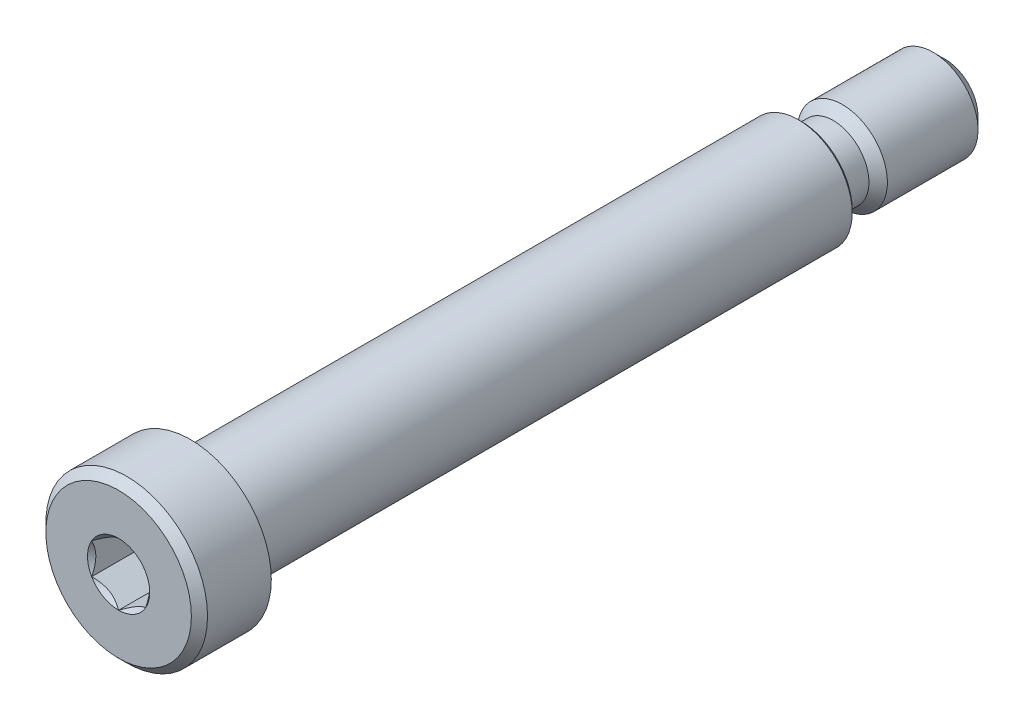
ISO-10303-21;
HEADER;
FILE_DESCRIPTION(('STEP AP214'),'2;1');
FILE_NAME('part.step','',(''),(''),'','','');
FILE_SCHEMA(('AUTOMOTIVE_DESIGN { 1 0 10303 214 1 1 1 1 }'));
ENDSEC;
DATA;
#1=APPLICATION_CONTEXT('core data for automotive mechanical design processes');
#2=APPLICATION_PROTOCOL_DEFINITION('international standard','automotive_design',2000,#1);
#3=PRODUCT_CONTEXT('',#1,'mechanical');
#4=PRODUCT('Part','Part','',(#3));
#5=PRODUCT_RELATED_PRODUCT_CATEGORY('part','',(#4));
#6=PRODUCT_DEFINITION_FORMATION('','',#4);
#7=PRODUCT_DEFINITION_CONTEXT('part definition',#1,'design');
#8=PRODUCT_DEFINITION('design','',#6,#7);
#9=PRODUCT_DEFINITION_SHAPE('','',#8);
#10=(LENGTH_UNIT() NAMED_UNIT(*) SI_UNIT(.MILLI.,.METRE.));
#11=(NAMED_UNIT(*) PLANE_ANGLE_UNIT() SI_UNIT($,.RADIAN.));
#12=(NAMED_UNIT(*) SI_UNIT($,.STERADIAN.) SOLID_ANGLE_UNIT());
#13=UNCERTAINTY_MEASURE_WITH_UNIT(LENGTH_MEASURE(1.E-05),#10,'distance_accuracy_value','');
#14=(GEOMETRIC_REPRESENTATION_CONTEXT(3) GLOBAL_UNCERTAINTY_ASSIGNED_CONTEXT((#13)) GLOBAL_UNIT_ASSIGNED_CONTEXT((#10,
#11,#12)) REPRESENTATION_CONTEXT('',''));
#15=CARTESIAN_POINT('',(0.,0.,0.));
#16=DIRECTION('',(0.,0.,1.));
#17=DIRECTION('',(1.,0.,0.));
#18=AXIS2_PLACEMENT_3D('',#15,#16,#17);
#19=CARTESIAN_POINT('',(0.,6.429375,36.5125));
#20=DIRECTION('',(0.,0.,-1.));
#21=DIRECTION('',(-1.,0.,0.));
#22=AXIS2_PLACEMENT_3D('',#19,#20,#21);
#23=PLANE('',#22);
#24=CARTESIAN_POINT('',(0.,0.,36.5125));
#25=DIRECTION('',(0.,0.,1.));
#26=DIRECTION('',(1.,0.,0.));
#27=AXIS2_PLACEMENT_3D('',#24,#25,#26);
#28=CIRCLE('',#27,2.74963065701559);
#29=CARTESIAN_POINT('',(-2.38125,1.3748153285078,36.5125));
#30=VERTEX_POINT('',#29);
#31=CARTESIAN_POINT('',(-2.38125,-1.37481532850779,36.5125));
#32=VERTEX_POINT('',#31);
#33=EDGE_CURVE('E135',#30,#32,#28,.T.);
#34=ORIENTED_EDGE('',*,*,#33,.F.);
#35=CARTESIAN_POINT('',(0.,2.74963065701559,36.5125));
#36=VERTEX_POINT('',#35);
#37=EDGE_CURVE('E130',#36,#30,#28,.T.);
#38=ORIENTED_EDGE('',*,*,#37,.F.);
#39=CARTESIAN_POINT('',(2.38124999999999,1.3748153285078,36.5125));
#40=VERTEX_POINT('',#39);
#41=EDGE_CURVE('E102',#40,#36,#28,.T.);
#42=ORIENTED_EDGE('',*,*,#41,.F.);
#43=CARTESIAN_POINT('',(2.38124999999999,-1.3748153285078,36.5125));
#44=VERTEX_POINT('',#43);
#45=EDGE_CURVE('E92',#44,#40,#28,.T.);
#46=ORIENTED_EDGE('',*,*,#45,.F.);
#47=CARTESIAN_POINT('',(0.,-2.74963065701559,36.5125));
#48=VERTEX_POINT('',#47);
#49=EDGE_CURVE('E53',#48,#44,#28,.T.);
#50=ORIENTED_EDGE('',*,*,#49,.F.);
#51=EDGE_CURVE('E60',#32,#48,#28,.T.);
#52=ORIENTED_EDGE('',*,*,#51,.F.);
#53=EDGE_LOOP('',(#34,#38,#42,#46,#50,#52));
#54=FACE_BOUND('',#53,.T.);
#55=CARTESIAN_POINT('',(0.,0.,36.5125));
#56=DIRECTION('',(0.,0.,1.));
#57=DIRECTION('',(1.,0.,0.));
#58=AXIS2_PLACEMENT_3D('',#55,#56,#57);
#59=CIRCLE('',#58,6.429375);
#60=CARTESIAN_POINT('',(6.429375,0.,36.5125));
#61=VERTEX_POINT('',#60);
#62=EDGE_CURVE('E47',#61,#61,#59,.T.);
#63=ORIENTED_EDGE('',*,*,#62,.T.);
#64=EDGE_LOOP('',(#63));
#65=FACE_BOUND('',#64,.T.);
#66=ADVANCED_FACE('F39',(#54,#65),#23,.F.);
#67=CARTESIAN_POINT('',(0.,0.,35.798125));
#68=DIRECTION('',(0.,0.,-1.));
#69=DIRECTION('',(-1.,0.,0.));
#70=AXIS2_PLACEMENT_3D('',#67,#68,#69);
#71=CONICAL_SURFACE('',#70,7.14375,0.78539816339745);
#72=ORIENTED_EDGE('',*,*,#62,.F.);
#73=EDGE_LOOP('',(#72));
#74=FACE_BOUND('',#73,.T.);
#75=CARTESIAN_POINT('',(0.,0.,35.798125));
#76=DIRECTION('',(0.,0.,1.));
#77=DIRECTION('',(1.,0.,0.));
#78=AXIS2_PLACEMENT_3D('',#75,#76,#77);
#79=CIRCLE('',#78,7.14375);
#80=CARTESIAN_POINT('',(7.14375,0.,35.798125));
#81=VERTEX_POINT('',#80);
#82=EDGE_CURVE('E283',#81,#81,#79,.T.);
#83=ORIENTED_EDGE('',*,*,#82,.T.);
#84=EDGE_LOOP('',(#83));
#85=FACE_BOUND('',#84,.T.);
#86=ADVANCED_FACE('F207',(#74,#85),#71,.T.);
#87=CARTESIAN_POINT('',(0.,0.,36.5125));
#88=DIRECTION('',(0.,0.,1.));
#89=DIRECTION('',(1.,0.,0.));
#90=AXIS2_PLACEMENT_3D('',#87,#88,#89);
#91=CYLINDRICAL_SURFACE('',#90,7.14375);
#92=ORIENTED_EDGE('',*,*,#82,.F.);
#93=EDGE_LOOP('',(#92));
#94=FACE_BOUND('',#93,.T.);
#95=CARTESIAN_POINT('',(0.,0.,30.1625));
#96=DIRECTION('',(0.,0.,1.));
#97=DIRECTION('',(1.,0.,0.));
#98=AXIS2_PLACEMENT_3D('',#95,#96,#97);
#99=CIRCLE('',#98,7.14375);
#100=CARTESIAN_POINT('',(7.14375,0.,30.1625));
#101=VERTEX_POINT('',#100);
#102=EDGE_CURVE('E280',#101,#101,#99,.T.);
#103=ORIENTED_EDGE('',*,*,#102,.T.);
#104=EDGE_LOOP('',(#103));
#105=FACE_BOUND('',#104,.T.);
#106=ADVANCED_FACE('F211',(#94,#105),#91,.T.);
#107=CARTESIAN_POINT('',(0.,7.14375,30.1625));
#108=DIRECTION('',(0.,0.,1.));
#109=DIRECTION('',(1.,0.,0.));
#110=AXIS2_PLACEMENT_3D('',#107,#108,#109);
#111=PLANE('',#110);
#112=ORIENTED_EDGE('',*,*,#102,.F.);
#113=EDGE_LOOP('',(#112));
#114=FACE_BOUND('',#113,.T.);
#115=CARTESIAN_POINT('',(0.,0.,30.1625));
#116=DIRECTION('',(0.,0.,1.));
#117=DIRECTION('',(1.,0.,0.));
#118=AXIS2_PLACEMENT_3D('',#115,#116,#117);
#119=CIRCLE('',#118,4.7625);
#120=CARTESIAN_POINT('',(4.7625,0.,30.1625));
#121=VERTEX_POINT('',#120);
#122=EDGE_CURVE('E277',#121,#121,#119,.T.);
#123=ORIENTED_EDGE('',*,*,#122,.T.);
#124=EDGE_LOOP('',(#123));
#125=FACE_BOUND('',#124,.T.);
#126=ADVANCED_FACE('F216',(#114,#125),#111,.F.);
#127=CARTESIAN_POINT('',(0.,0.,36.5125));
#128=DIRECTION('',(0.,0.,1.));
#129=DIRECTION('',(1.,0.,0.));
#130=AXIS2_PLACEMENT_3D('',#127,#128,#129);
#131=CYLINDRICAL_SURFACE('',#130,4.7625);
#132=ORIENTED_EDGE('',*,*,#122,.F.);
#133=EDGE_LOOP('',(#132));
#134=FACE_BOUND('',#133,.T.);
#135=CARTESIAN_POINT('',(0.,0.,-23.5500333333333));
#136=DIRECTION('',(0.,0.,1.));
#137=DIRECTION('',(1.,0.,0.));
#138=AXIS2_PLACEMENT_3D('',#135,#136,#137);
#139=CIRCLE('',#138,4.7625);
#140=CARTESIAN_POINT('',(4.7625,0.,-23.5500333333333));
#141=VERTEX_POINT('',#140);
#142=EDGE_CURVE('E274',#141,#141,#139,.T.);
#143=ORIENTED_EDGE('',*,*,#142,.T.);
#144=EDGE_LOOP('',(#143));
#145=FACE_BOUND('',#144,.T.);
#146=ADVANCED_FACE('F224',(#134,#145),#131,.T.);
#147=CARTESIAN_POINT('',(0.,0.,-23.8125));
#148=DIRECTION('',(0.,0.,1.));
#149=DIRECTION('',(1.,0.,0.));
#150=AXIS2_PLACEMENT_3D('',#147,#148,#149);
#151=CONICAL_SURFACE('',#150,4.50003333333333,0.785398163397443);
#152=ORIENTED_EDGE('',*,*,#142,.F.);
#153=EDGE_LOOP('',(#152));
#154=FACE_BOUND('',#153,.T.);
#155=CARTESIAN_POINT('',(0.,0.,-23.8125));
#156=DIRECTION('',(0.,0.,1.));
#157=DIRECTION('',(1.,0.,0.));
#158=AXIS2_PLACEMENT_3D('',#155,#156,#157);
#159=CIRCLE('',#158,4.50003333333333);
#160=CARTESIAN_POINT('',(4.50003333333333,0.,-23.8125));
#161=VERTEX_POINT('',#160);
#162=EDGE_CURVE('E262',#161,#161,#159,.T.);
#163=ORIENTED_EDGE('',*,*,#162,.T.);
#164=EDGE_LOOP('',(#163));
#165=FACE_BOUND('',#164,.T.);
#166=ADVANCED_FACE('F228',(#154,#165),#151,.T.);
#167=CARTESIAN_POINT('',(0.,4.50003333333333,-23.8125));
#168=DIRECTION('',(0.,0.,1.));
#169=DIRECTION('',(1.,0.,0.));
#170=AXIS2_PLACEMENT_3D('',#167,#168,#169);
#171=PLANE('',#170);
#172=CARTESIAN_POINT('',(0.,0.,-23.8125));
#173=DIRECTION('',(0.,0.,-1.));
#174=DIRECTION('',(-1.,0.,0.));
#175=AXIS2_PLACEMENT_3D('',#172,#173,#174);
#176=CIRCLE('',#175,3.9751);
#177=CARTESIAN_POINT('',(-3.9751,0.,-23.8125));
#178=VERTEX_POINT('',#177);
#179=EDGE_CURVE('E537',#178,#178,#176,.T.);
#180=ORIENTED_EDGE('',*,*,#179,.F.);
#181=EDGE_LOOP('',(#180));
#182=FACE_BOUND('',#181,.T.);
#183=ORIENTED_EDGE('',*,*,#162,.F.);
#184=EDGE_LOOP('',(#183));
#185=FACE_BOUND('',#184,.T.);
#186=ADVANCED_FACE('F232',(#182,#185),#171,.F.);
#187=CARTESIAN_POINT('',(0.,0.,36.5125));
#188=DIRECTION('',(0.,0.,1.));
#189=DIRECTION('',(1.,0.,0.));
#190=AXIS2_PLACEMENT_3D('',#187,#188,#189);
#191=CONICAL_SURFACE('',#190,2.74963065701559,0.78539816339745);
#192=ORIENTED_EDGE('',*,*,#41,.T.);
#193=CARTESIAN_POINT('',(2.38145,1.37469985845396,36.5126154773272));
#194=CARTESIAN_POINT('',(2.29959321762095,1.4219598937955,36.4653948967095));
#195=CARTESIAN_POINT('',(2.21636766622824,1.47001018829554,36.4209475752929));
#196=CARTESIAN_POINT('',(2.04666151916196,1.56799007798739,36.3395654569856));
#197=CARTESIAN_POINT('',(1.9601647826469,1.61792899209838,36.3026759430951));
#198=CARTESIAN_POINT('',(1.78574822599096,1.71862843803482,36.2394834131659));
#199=CARTESIAN_POINT('',(1.69787282881932,1.769363322247,36.2130215587295));
#200=CARTESIAN_POINT('',(1.52018740592912,1.87195004898373,36.1722515156161));
#201=CARTESIAN_POINT('',(1.43038280881413,1.92379875730254,36.1579128915306));
#202=CARTESIAN_POINT('',(1.27561039686966,2.01315665100181,36.1449757847701));
#203=CARTESIAN_POINT('',(1.21084255103038,2.05055038423195,36.1430606046532));
#204=CARTESIAN_POINT('',(1.08141272066443,2.1252767316349,36.1462866227677));
#205=CARTESIAN_POINT('',(1.01675078120665,2.16260931978717,36.1514302948571));
#206=CARTESIAN_POINT('',(0.888037451422605,2.23692199538628,36.1684813108716));
#207=CARTESIAN_POINT('',(0.823986825765148,2.27390164135138,36.1803962213493));
#208=CARTESIAN_POINT('',(0.696993161094728,2.34722146783422,36.210335672352));
#209=CARTESIAN_POINT('',(0.634050037564177,2.38356169714822,36.2283597445184));
#210=CARTESIAN_POINT('',(0.472823849267819,2.47664568036154,36.2818688075524));
#211=CARTESIAN_POINT('',(0.375540508712161,2.53281224321902,36.3213874208722));
#212=CARTESIAN_POINT('',(0.232493937374431,2.61540021968751,36.3881003435508));
#213=CARTESIAN_POINT('',(0.185353711056036,2.64261664204209,36.4115402091113));
#214=CARTESIAN_POINT('',(0.0919464736333613,2.69654533571233,36.4605566766595));
#215=CARTESIAN_POINT('',(0.0456789475031773,2.72325790437833,36.4861319667669));
#216=CARTESIAN_POINT('',(-0.000200000000001808,2.74974612706943,36.5126154773272));
#217=B_SPLINE_CURVE_WITH_KNOTS('',3,(#193,#194,#195,#196,#197,#198,#199,#200,#201,#202,#203,
#204,#205,#206,#207,#208,#209,#210,#211,#212,#213,#214,#215,#216),.UNSPECIFIED.,.F.,.F.,(4,2,2,
2,2,2,2,2,2,2,2,4),(0.,0.317196610611948,0.636241461041215,0.950218950629216,1.26340583824125,
1.48752413747843,1.71172100167746,1.93616888974081,2.16059957440835,2.51709639744762,
2.69486147369098,2.87251813383154),.UNSPECIFIED.);
#218=EDGE_CURVE('E11',#40,#36,#217,.T.);
#219=ORIENTED_EDGE('',*,*,#218,.F.);
#220=EDGE_LOOP('',(#192,#219));
#221=FACE_BOUND('',#220,.T.);
#222=ADVANCED_FACE('F105',(#221),#191,.F.);
#223=ORIENTED_EDGE('',*,*,#37,.T.);
#224=CARTESIAN_POINT('',(0.000199999999998976,2.74974612706943,36.5126154773272));
#225=CARTESIAN_POINT('',(-0.0816567823790497,2.70248609172789,36.4653948967095));
#226=CARTESIAN_POINT('',(-0.164882333771759,2.65443579722785,36.4209475752929));
#227=CARTESIAN_POINT('',(-0.334588480838038,2.556455907536,36.3395654569856));
#228=CARTESIAN_POINT('',(-0.421085217353101,2.50651699342501,36.3026759430951));
#229=CARTESIAN_POINT('',(-0.59550177400904,2.40581754748857,36.2394834131659));
#230=CARTESIAN_POINT('',(-0.683377171180672,2.35508266327639,36.2130215587295));
#231=CARTESIAN_POINT('',(-0.861062594070872,2.25249593653966,36.1722515156161));
#232=CARTESIAN_POINT('',(-0.950867191185867,2.20064722822085,36.1579128915305));
#233=CARTESIAN_POINT('',(-1.10563960313034,2.11128933452158,36.1449757847701));
#234=CARTESIAN_POINT('',(-1.17040744896961,2.07389560129144,36.1430606046532));
#235=CARTESIAN_POINT('',(-1.29983727933557,1.99916925388849,36.1462866227677));
#236=CARTESIAN_POINT('',(-1.36449921879335,1.96183666573622,36.1514302948571));
#237=CARTESIAN_POINT('',(-1.49321254857739,1.88752399013711,36.1684813108716));
#238=CARTESIAN_POINT('',(-1.55726317423485,1.85054434417201,36.1803962213493));
#239=CARTESIAN_POINT('',(-1.68425683890527,1.77722451768917,36.210335672352));
#240=CARTESIAN_POINT('',(-1.74719996243582,1.74088428837517,36.2283597445184));
#241=CARTESIAN_POINT('',(-1.90842615073218,1.64780030516185,36.2818688075524));
#242=CARTESIAN_POINT('',(-2.00570949128784,1.59163374230437,36.3213874208722));
#243=CARTESIAN_POINT('',(-2.14875606262557,1.50904576583588,36.3881003435508));
#244=CARTESIAN_POINT('',(-2.19589628894396,1.4818293434813,36.4115402091113));
#245=CARTESIAN_POINT('',(-2.28930352636664,1.42790064981105,36.4605566766595));
#246=CARTESIAN_POINT('',(-2.33557105249682,1.40118808114505,36.4861319667669));
#247=CARTESIAN_POINT('',(-2.38145,1.37469985845396,36.5126154773272));
#248=B_SPLINE_CURVE_WITH_KNOTS('',3,(#224,#225,#226,#227,#228,#229,#230,#231,#232,#233,#234,
#235,#236,#237,#238,#239,#240,#241,#242,#243,#244,#245,#246,#247),.UNSPECIFIED.,.F.,.F.,(4,2,2,
2,2,2,2,2,2,2,2,4),(0.,0.317196610611946,0.636241461041214,0.950218950629218,1.26340583824125,
1.48752413747843,1.71172100167746,1.93616888974081,2.16059957440835,2.51709639744763,
2.69486147369099,2.87251813383154),.UNSPECIFIED.);
#249=EDGE_CURVE('E131',#36,#30,#248,.T.);
#250=ORIENTED_EDGE('',*,*,#249,.F.);
#251=EDGE_LOOP('',(#223,#250));
#252=FACE_BOUND('',#251,.T.);
#253=ADVANCED_FACE('F310',(#252),#191,.F.);
#254=ORIENTED_EDGE('',*,*,#33,.T.);
#255=CARTESIAN_POINT('',(-2.38125,-2.74194290629281,37.3944808948811));
#256=CARTESIAN_POINT('',(-2.38125,-2.67517961094815,37.3440846682677));
#257=CARTESIAN_POINT('',(-2.38125,-2.60804251150404,37.2941755878687));
#258=CARTESIAN_POINT('',(-2.38125,-2.47287325090702,37.1955498312406));
#259=CARTESIAN_POINT('',(-2.38125,-2.40484086929574,37.1468334574882));
#260=CARTESIAN_POINT('',(-2.38125,-2.26723593537395,37.0504648546737));
#261=CARTESIAN_POINT('',(-2.38125,-2.19765553376831,37.0028237956413));
#262=CARTESIAN_POINT('',(-2.38125,-2.05731367870618,36.9093199235723));
#263=CARTESIAN_POINT('',(-2.38125,-1.98655230919794,36.863456984903));
#264=CARTESIAN_POINT('',(-2.38125,-1.83957751933872,36.7713459008639));
#265=CARTESIAN_POINT('',(-2.38125,-1.76328362015338,36.7252255175311));
#266=CARTESIAN_POINT('',(-2.38125,-1.60891357724904,36.6360183040048));
#267=CARTESIAN_POINT('',(-2.38125,-1.53083712168148,36.592932010078));
#268=CARTESIAN_POINT('',(-2.38125,-1.37291620350605,36.5107265015513));
#269=CARTESIAN_POINT('',(-2.38125,-1.29307799952834,36.4715953579213));
#270=CARTESIAN_POINT('',(-2.38125,-1.13121425104689,36.3981679503644));
#271=CARTESIAN_POINT('',(-2.38125,-1.04918943691787,36.3638700954936));
#272=CARTESIAN_POINT('',(-2.38125,-0.889535256852428,36.3038546314485));
#273=CARTESIAN_POINT('',(-2.38125,-0.812083865872988,36.2776684784655));
#274=CARTESIAN_POINT('',(-2.38125,-0.655316366649848,36.2315097515196));
#275=CARTESIAN_POINT('',(-2.38125,-0.5760001303489,36.2115376056152));
#276=CARTESIAN_POINT('',(-2.38125,-0.417295761724886,36.1791821452753));
#277=CARTESIAN_POINT('',(-2.38125,-0.337934577044911,36.1666688083777));
#278=CARTESIAN_POINT('',(-2.38125,-0.178363853149434,36.1494738601797));
#279=CARTESIAN_POINT('',(-2.38125,-0.098154462150851,36.1447909026206));
#280=CARTESIAN_POINT('',(-2.38125,0.059418803226009,36.1436044408343));
#281=CARTESIAN_POINT('',(-2.38125,0.136780588312046,36.1468110104925));
#282=CARTESIAN_POINT('',(-2.38125,0.290840960378522,36.1605870567153));
#283=CARTESIAN_POINT('',(-2.38125,0.367539482199549,36.1711572485512));
#284=CARTESIAN_POINT('',(-2.38125,0.521017492585625,36.1992628297993));
#285=CARTESIAN_POINT('',(-2.38125,0.597774958137447,36.2169167488691));
#286=CARTESIAN_POINT('',(-2.38125,0.74960981398739,36.2582513961625));
#287=CARTESIAN_POINT('',(-2.38125,0.824687344292227,36.2819316201001));
#288=CARTESIAN_POINT('',(-2.38125,1.06107814376439,36.3653948628217));
#289=CARTESIAN_POINT('',(-2.38125,1.21904786183135,36.4346839268647));
#290=CARTESIAN_POINT('',(-2.38125,1.45021000221341,36.5501640836207));
#291=CARTESIAN_POINT('',(-2.38125,1.52644290394185,36.5906730569973));
#292=CARTESIAN_POINT('',(-2.38125,1.67717618485052,36.6748026889314));
#293=CARTESIAN_POINT('',(-2.38125,1.75167687303398,36.7184227867715));
#294=CARTESIAN_POINT('',(-2.38125,1.89548152028666,36.8059125561176));
#295=CARTESIAN_POINT('',(-2.38125,1.96485959547431,36.84966179235));
#296=CARTESIAN_POINT('',(-2.38125,2.10242624345816,36.9390011582982));
#297=CARTESIAN_POINT('',(-2.38125,2.17061472559402,36.9845914274512));
#298=CARTESIAN_POINT('',(-2.38125,2.3054031724641,37.0769060045998));
#299=CARTESIAN_POINT('',(-2.38125,2.37201154149389,37.1236180923826));
#300=CARTESIAN_POINT('',(-2.38125,2.50431799978026,37.2182775774644));
#301=CARTESIAN_POINT('',(-2.38125,2.57001633432537,37.2662246315223));
#302=CARTESIAN_POINT('',(-2.38125,2.63533378775873,37.3146767329484));
#303=B_SPLINE_CURVE_WITH_KNOTS('',3,(#255,#256,#257,#258,#259,#260,#261,#262,#263,#264,#265,
#266,#267,#268,#269,#270,#271,#272,#273,#274,#275,#276,#277,#278,#279,#280,#281,#282,#283,#284,
#285,#286,#287,#288,#289,#290,#291,#292,#293,#294,#295,#296,#297,#298,#299,#300,#301,#302),
.UNSPECIFIED.,.F.,.F.,(4,2,2,2,2,2,2,2,2,2,2,2,2,2,2,2,2,2,2,2,2,2,2,4),(0.,0.250951284057751,
0.501965564923428,0.754924776117816,1.00786608183831,1.2752620782364,1.54270521810291,
1.80931602064962,2.0758388585355,2.32089852628726,2.56597507150036,2.80664400340548,
3.04727155341464,3.27918940999225,3.51112979724109,3.74712477430216,3.98310000960233,
4.49898139186047,4.75794323923242,5.01685853131886,5.26288959989713,5.50893933760937,
5.7529903835543,5.99697431578282),.UNSPECIFIED.);
#304=EDGE_CURVE('E133',#30,#32,#303,.F.);
#305=ORIENTED_EDGE('',*,*,#304,.F.);
#306=EDGE_LOOP('',(#254,#305));
#307=FACE_BOUND('',#306,.T.);
#308=ADVANCED_FACE('F303',(#307),#191,.F.);
#309=ORIENTED_EDGE('',*,*,#51,.T.);
#310=CARTESIAN_POINT('',(-2.38145,-1.37469985845396,36.5126154773272));
#311=CARTESIAN_POINT('',(-2.29959321762095,-1.4219598937955,36.4653948967095));
#312=CARTESIAN_POINT('',(-2.21636766622824,-1.47001018829554,36.4209475752929));
#313=CARTESIAN_POINT('',(-2.04666151916196,-1.56799007798739,36.3395654569856));
#314=CARTESIAN_POINT('',(-1.9601647826469,-1.61792899209839,36.3026759430951));
#315=CARTESIAN_POINT('',(-1.78574822599096,-1.71862843803482,36.2394834131659));
#316=CARTESIAN_POINT('',(-1.69787282881933,-1.76936332224701,36.2130215587295));
#317=CARTESIAN_POINT('',(-1.52018740592912,-1.87195004898374,36.1722515156161));
#318=CARTESIAN_POINT('',(-1.43038280881413,-1.92379875730255,36.1579128915306));
#319=CARTESIAN_POINT('',(-1.27561039686966,-2.01315665100181,36.1449757847701));
#320=CARTESIAN_POINT('',(-1.21084255103038,-2.05055038423195,36.1430606046532));
#321=CARTESIAN_POINT('',(-1.08141272066443,-2.1252767316349,36.1462866227677));
#322=CARTESIAN_POINT('',(-1.01675078120664,-2.16260931978718,36.1514302948571));
#323=CARTESIAN_POINT('',(-0.888037451422603,-2.23692199538629,36.1684813108716));
#324=CARTESIAN_POINT('',(-0.823986825765145,-2.27390164135139,36.1803962213493));
#325=CARTESIAN_POINT('',(-0.696993161094726,-2.34722146783423,36.210335672352));
#326=CARTESIAN_POINT('',(-0.634050037564176,-2.38356169714823,36.2283597445185));
#327=CARTESIAN_POINT('',(-0.472823849267818,-2.47664568036155,36.2818688075524));
#328=CARTESIAN_POINT('',(-0.375540508712159,-2.53281224321902,36.3213874208722));
#329=CARTESIAN_POINT('',(-0.23249393737443,-2.61540021968751,36.3881003435508));
#330=CARTESIAN_POINT('',(-0.185353711056037,-2.6426166420421,36.4115402091113));
#331=CARTESIAN_POINT('',(-0.0919464736333644,-2.69654533571234,36.4605566766595));
#332=CARTESIAN_POINT('',(-0.0456789475031817,-2.72325790437834,36.4861319667669));
#333=CARTESIAN_POINT('',(0.000199999999996993,-2.74974612706943,36.5126154773272));
#334=B_SPLINE_CURVE_WITH_KNOTS('',3,(#310,#311,#312,#313,#314,#315,#316,#317,#318,#319,#320,
#321,#322,#323,#324,#325,#326,#327,#328,#329,#330,#331,#332,#333),.UNSPECIFIED.,.F.,.F.,(4,2,2,
2,2,2,2,2,2,2,2,4),(0.,0.317196610611951,0.636241461041219,0.950218950629223,1.26340583824126,
1.48752413747844,1.71172100167747,1.93616888974082,2.16059957440836,2.51709639744763,
2.69486147369099,2.87251813383154),.UNSPECIFIED.);
#335=EDGE_CURVE('E173',#32,#48,#334,.T.);
#336=ORIENTED_EDGE('',*,*,#335,.F.);
#337=EDGE_LOOP('',(#309,#336));
#338=FACE_BOUND('',#337,.T.);
#339=ADVANCED_FACE('F304',(#338),#191,.F.);
#340=ORIENTED_EDGE('',*,*,#49,.T.);
#341=CARTESIAN_POINT('',(-0.000200000000001862,-2.74974612706943,36.5126154773272));
#342=CARTESIAN_POINT('',(0.0816567823790485,-2.70248609172789,36.4653948967095));
#343=CARTESIAN_POINT('',(0.164882333771759,-2.65443579722786,36.4209475752929));
#344=CARTESIAN_POINT('',(0.334588480838039,-2.556455907536,36.3395654569856));
#345=CARTESIAN_POINT('',(0.421085217353102,-2.50651699342501,36.3026759430951));
#346=CARTESIAN_POINT('',(0.595501774009041,-2.40581754748857,36.2394834131659));
#347=CARTESIAN_POINT('',(0.683377171180674,-2.35508266327639,36.2130215587295));
#348=CARTESIAN_POINT('',(0.861062594070875,-2.25249593653966,36.1722515156161));
#349=CARTESIAN_POINT('',(0.950867191185871,-2.20064722822085,36.1579128915306));
#350=CARTESIAN_POINT('',(1.10563960313034,-2.11128933452158,36.1449757847701));
#351=CARTESIAN_POINT('',(1.17040744896962,-2.07389560129144,36.1430606046532));
#352=CARTESIAN_POINT('',(1.29983727933557,-1.99916925388849,36.1462866227677));
#353=CARTESIAN_POINT('',(1.36449921879336,-1.96183666573622,36.1514302948571));
#354=CARTESIAN_POINT('',(1.4932125485774,-1.88752399013711,36.1684813108716));
#355=CARTESIAN_POINT('',(1.55726317423485,-1.85054434417201,36.1803962213493));
#356=CARTESIAN_POINT('',(1.68425683890527,-1.77722451768917,36.210335672352));
#357=CARTESIAN_POINT('',(1.74719996243582,-1.74088428837517,36.2283597445185));
#358=CARTESIAN_POINT('',(1.90842615073218,-1.64780030516185,36.2818688075524));
#359=CARTESIAN_POINT('',(2.00570949128784,-1.59163374230437,36.3213874208722));
#360=CARTESIAN_POINT('',(2.14875606262557,-1.50904576583588,36.3881003435508));
#361=CARTESIAN_POINT('',(2.19589628894396,-1.4818293434813,36.4115402091113));
#362=CARTESIAN_POINT('',(2.28930352636664,-1.42790064981106,36.4605566766595));
#363=CARTESIAN_POINT('',(2.33557105249682,-1.40118808114506,36.4861319667669));
#364=CARTESIAN_POINT('',(2.38145,-1.37469985845396,36.5126154773272));
#365=B_SPLINE_CURVE_WITH_KNOTS('',3,(#341,#342,#343,#344,#345,#346,#347,#348,#349,#350,#351,
#352,#353,#354,#355,#356,#357,#358,#359,#360,#361,#362,#363,#364),.UNSPECIFIED.,.F.,.F.,(4,2,2,
2,2,2,2,2,2,2,2,4),(0.,0.31719661061195,0.636241461041218,0.950218950629223,1.26340583824126,
1.48752413747844,1.71172100167747,1.93616888974082,2.16059957440836,2.51709639744762,
2.69486147369099,2.87251813383154),.UNSPECIFIED.);
#366=EDGE_CURVE('E117',#48,#44,#365,.T.);
#367=ORIENTED_EDGE('',*,*,#366,.F.);
#368=EDGE_LOOP('',(#340,#367));
#369=FACE_BOUND('',#368,.T.);
#370=ADVANCED_FACE('F159',(#369),#191,.F.);
#371=ORIENTED_EDGE('',*,*,#45,.T.);
#372=CARTESIAN_POINT('',(2.38125,-2.74194290589387,37.3944808945799));
#373=CARTESIAN_POINT('',(2.38125,-2.6751796105604,37.3440846679781));
#374=CARTESIAN_POINT('',(2.38125,-2.60804251112753,37.2941755875907));
#375=CARTESIAN_POINT('',(2.38125,-2.47287325055307,37.1955498309857));
#376=CARTESIAN_POINT('',(2.38125,-2.40484086895313,37.1468334572448));
#377=CARTESIAN_POINT('',(2.38125,-2.26723593505441,37.0504648544534));
#378=CARTESIAN_POINT('',(2.38125,-2.19765553346049,37.0028237954326));
#379=CARTESIAN_POINT('',(2.38125,-2.05731367842203,36.9093199233866));
#380=CARTESIAN_POINT('',(2.38125,-1.98655230892573,36.8634569847287));
#381=CARTESIAN_POINT('',(2.38125,-1.83957751909226,36.7713459007133));
#382=CARTESIAN_POINT('',(2.38125,-1.76328361992076,36.7252255173928));
#383=CARTESIAN_POINT('',(2.38125,-1.6089135770446,36.6360183038905));
#384=CARTESIAN_POINT('',(2.38125,-1.53083712149137,36.5929320099754));
#385=CARTESIAN_POINT('',(2.38125,-1.37291620334514,36.5107265014712));
#386=CARTESIAN_POINT('',(2.38125,-1.29307799938228,36.4715953578519));
#387=CARTESIAN_POINT('',(2.38125,-1.13121425093133,36.3981679503152));
#388=CARTESIAN_POINT('',(2.38125,-1.04918943681796,36.3638700954538));
#389=CARTESIAN_POINT('',(2.38125,-0.889535256759271,36.3038546314156));
#390=CARTESIAN_POINT('',(2.38125,-0.812083865770258,36.277668478432));
#391=CARTESIAN_POINT('',(2.38125,-0.655316366527662,36.2315097514868));
#392=CARTESIAN_POINT('',(2.38125,-0.576000130216832,36.2115376055837));
#393=CARTESIAN_POINT('',(2.38125,-0.417295761573377,36.1791821452488));
#394=CARTESIAN_POINT('',(2.38125,-0.337934576883849,36.1666688083547));
#395=CARTESIAN_POINT('',(2.38125,-0.178363852969586,36.1494738601659));
#396=CARTESIAN_POINT('',(2.38125,-0.0981544619617699,36.1447909026126));
#397=CARTESIAN_POINT('',(2.38125,0.0594188034321258,36.1436044408392));
#398=CARTESIAN_POINT('',(2.38125,0.136780588525989,36.1468110105046));
#399=CARTESIAN_POINT('',(2.38125,0.290840960607335,36.1605870567428));
#400=CARTESIAN_POINT('',(2.38125,0.367539482435405,36.1711572485871));
#401=CARTESIAN_POINT('',(2.38125,0.521017492835385,36.1992628298525));
#402=CARTESIAN_POINT('',(2.38125,0.597774958394046,36.2169167489314));
#403=CARTESIAN_POINT('',(2.38125,0.749609814257007,36.2582513962434));
#404=CARTESIAN_POINT('',(2.38125,0.824687344568024,36.2819316201904));
#405=CARTESIAN_POINT('',(2.38125,1.06107814410025,36.365394862956));
#406=CARTESIAN_POINT('',(2.38125,1.21904786221809,36.4346839270396));
#407=CARTESIAN_POINT('',(2.38125,1.45021000267341,36.5501640838597));
#408=CARTESIAN_POINT('',(2.38125,1.52644290442583,36.5906730572583));
#409=CARTESIAN_POINT('',(2.38125,1.67717618538171,36.6748026892371));
#410=CARTESIAN_POINT('',(2.38125,1.75167687358839,36.7184227870999));
#411=CARTESIAN_POINT('',(2.38125,1.89548152088327,36.805912556489));
#412=CARTESIAN_POINT('',(2.38125,1.96485959608997,36.8496617927418));
#413=CARTESIAN_POINT('',(2.38125,2.10242624411167,36.9390011587306));
#414=CARTESIAN_POINT('',(2.38125,2.17061472626632,36.984591427904));
#415=CARTESIAN_POINT('',(2.38125,2.30540317317353,37.0769060050932));
#416=CARTESIAN_POINT('',(2.38125,2.37201154222165,37.1236180928962));
#417=CARTESIAN_POINT('',(2.38125,2.50431800054458,37.2182775780183));
#418=CARTESIAN_POINT('',(2.38125,2.57001633510791,37.2662246320963));
#419=CARTESIAN_POINT('',(2.38125,2.63533378855946,37.3146767335425));
#420=B_SPLINE_CURVE_WITH_KNOTS('',3,(#372,#373,#374,#375,#376,#377,#378,#379,#380,#381,#382,
#383,#384,#385,#386,#387,#388,#389,#390,#391,#392,#393,#394,#395,#396,#397,#398,#399,#400,#401,
#402,#403,#404,#405,#406,#407,#408,#409,#410,#411,#412,#413,#414,#415,#416,#417,#418,#419),
.UNSPECIFIED.,.F.,.F.,(4,2,2,2,2,2,2,2,2,2,2,2,2,2,2,2,2,2,2,2,2,2,2,4),(0.,0.250951284009989,
0.50196556482789,0.754924775973593,1.00786608164543,1.27526207798892,1.54270521780083,
1.80931602029339,2.0758388581252,2.32089852590465,2.56597507114536,2.80664400307699,
3.04727155311265,3.27918940971451,3.51112979698762,3.74712477407483,3.98310000940112,
4.49898139184704,4.75794323931353,5.01685853149448,5.2628896001536,5.50893933794671,
5.75299038397141,5.9969743162797),.UNSPECIFIED.);
#421=EDGE_CURVE('E96',#44,#40,#420,.T.);
#422=ORIENTED_EDGE('',*,*,#421,.F.);
#423=EDGE_LOOP('',(#371,#422));
#424=FACE_BOUND('',#423,.T.);
#425=ADVANCED_FACE('F94',(#424),#191,.F.);
#426=CARTESIAN_POINT('',(0.,0.,31.75));
#427=DIRECTION('',(0.,0.,1.));
#428=DIRECTION('',(1.,0.,0.));
#429=AXIS2_PLACEMENT_3D('',#426,#427,#428);
#430=PLANE('',#429);
#431=DIRECTION('',(0.,1.,0.));
#432=VECTOR('',#431,1.);
#433=CARTESIAN_POINT('',(2.38125,-1.3748153285078,31.75));
#434=LINE('',#433,#432);
#435=CARTESIAN_POINT('',(2.38125,-1.3748153285078,31.75));
#436=VERTEX_POINT('',#435);
#437=CARTESIAN_POINT('',(2.38125,1.3748153285078,31.75));
#438=VERTEX_POINT('',#437);
#439=EDGE_CURVE('E116',#436,#438,#434,.T.);
#440=ORIENTED_EDGE('',*,*,#439,.T.);
#441=DIRECTION('',(-0.866025403784439,0.5,0.));
#442=VECTOR('',#441,1.);
#443=CARTESIAN_POINT('',(2.38125,1.3748153285078,31.75));
#444=LINE('',#443,#442);
#445=CARTESIAN_POINT('',(0.,2.74963065701559,31.75));
#446=VERTEX_POINT('',#445);
#447=EDGE_CURVE('E121',#438,#446,#444,.T.);
#448=ORIENTED_EDGE('',*,*,#447,.T.);
#449=DIRECTION('',(-0.866025403784439,-0.5,0.));
#450=VECTOR('',#449,1.);
#451=CARTESIAN_POINT('',(0.,2.74963065701559,31.75));
#452=LINE('',#451,#450);
#453=CARTESIAN_POINT('',(-2.38125,1.3748153285078,31.75));
#454=VERTEX_POINT('',#453);
#455=EDGE_CURVE('E251',#446,#454,#452,.T.);
#456=ORIENTED_EDGE('',*,*,#455,.T.);
#457=DIRECTION('',(0.,-1.,0.));
#458=VECTOR('',#457,1.);
#459=CARTESIAN_POINT('',(-2.38125,1.3748153285078,31.75));
#460=LINE('',#459,#458);
#461=CARTESIAN_POINT('',(-2.38125,-1.3748153285078,31.75));
#462=VERTEX_POINT('',#461);
#463=EDGE_CURVE('E255',#454,#462,#460,.T.);
#464=ORIENTED_EDGE('',*,*,#463,.T.);
#465=DIRECTION('',(0.866025403784439,-0.5,0.));
#466=VECTOR('',#465,1.);
#467=CARTESIAN_POINT('',(-2.38125,-1.3748153285078,31.75));
#468=LINE('',#467,#466);
#469=CARTESIAN_POINT('',(0.,-2.7496306570156,31.75));
#470=VERTEX_POINT('',#469);
#471=EDGE_CURVE('E258',#462,#470,#468,.T.);
#472=ORIENTED_EDGE('',*,*,#471,.T.);
#473=DIRECTION('',(0.866025403784439,0.5,0.));
#474=VECTOR('',#473,1.);
#475=CARTESIAN_POINT('',(0.,-2.7496306570156,31.75));
#476=LINE('',#475,#474);
#477=EDGE_CURVE('E124',#470,#436,#476,.T.);
#478=ORIENTED_EDGE('',*,*,#477,.T.);
#479=EDGE_LOOP('',(#440,#448,#456,#464,#472,#478));
#480=FACE_BOUND('',#479,.T.);
#481=ADVANCED_FACE('F158',(#480),#430,.T.);
#482=CARTESIAN_POINT('',(2.38125,1.3748153285078,31.75));
#483=DIRECTION('',(0.5,0.866025403784439,0.));
#484=DIRECTION('',(-0.866025403784439,0.5,0.));
#485=AXIS2_PLACEMENT_3D('',#482,#483,#484);
#486=PLANE('',#485);
#487=DIRECTION('',(0.,0.,1.));
#488=VECTOR('',#487,1.);
#489=CARTESIAN_POINT('',(2.38125,1.3748153285078,31.75));
#490=LINE('',#489,#488);
#491=EDGE_CURVE('E113',#438,#40,#490,.T.);
#492=ORIENTED_EDGE('',*,*,#491,.T.);
#493=ORIENTED_EDGE('',*,*,#218,.T.);
#494=DIRECTION('',(0.,0.,1.));
#495=VECTOR('',#494,1.);
#496=CARTESIAN_POINT('',(0.,2.74963065701559,31.75));
#497=LINE('',#496,#495);
#498=EDGE_CURVE('E123',#446,#36,#497,.T.);
#499=ORIENTED_EDGE('',*,*,#498,.F.);
#500=ORIENTED_EDGE('',*,*,#447,.F.);
#501=EDGE_LOOP('',(#492,#493,#499,#500));
#502=FACE_BOUND('',#501,.T.);
#503=ADVANCED_FACE('F119',(#502),#486,.F.);
#504=CARTESIAN_POINT('',(0.,2.74963065701559,31.75));
#505=DIRECTION('',(-0.5,0.866025403784439,0.));
#506=DIRECTION('',(-0.866025403784439,-0.5,0.));
#507=AXIS2_PLACEMENT_3D('',#504,#505,#506);
#508=PLANE('',#507);
#509=ORIENTED_EDGE('',*,*,#498,.T.);
#510=ORIENTED_EDGE('',*,*,#249,.T.);
#511=DIRECTION('',(0.,0.,1.));
#512=VECTOR('',#511,1.);
#513=CARTESIAN_POINT('',(-2.38125,1.3748153285078,31.75));
#514=LINE('',#513,#512);
#515=EDGE_CURVE('E269',#454,#30,#514,.T.);
#516=ORIENTED_EDGE('',*,*,#515,.F.);
#517=ORIENTED_EDGE('',*,*,#455,.F.);
#518=EDGE_LOOP('',(#509,#510,#516,#517));
#519=FACE_BOUND('',#518,.T.);
#520=ADVANCED_FACE('F151',(#519),#508,.F.);
#521=CARTESIAN_POINT('',(-2.38125,1.3748153285078,31.75));
#522=DIRECTION('',(-1.,0.,0.));
#523=DIRECTION('',(0.,-1.,0.));
#524=AXIS2_PLACEMENT_3D('',#521,#522,#523);
#525=PLANE('',#524);
#526=ORIENTED_EDGE('',*,*,#515,.T.);
#527=ORIENTED_EDGE('',*,*,#304,.T.);
#528=DIRECTION('',(0.,0.,1.));
#529=VECTOR('',#528,1.);
#530=CARTESIAN_POINT('',(-2.38125,-1.3748153285078,31.75));
#531=LINE('',#530,#529);
#532=EDGE_CURVE('E266',#462,#32,#531,.T.);
#533=ORIENTED_EDGE('',*,*,#532,.F.);
#534=ORIENTED_EDGE('',*,*,#463,.F.);
#535=EDGE_LOOP('',(#526,#527,#533,#534));
#536=FACE_BOUND('',#535,.T.);
#537=ADVANCED_FACE('F197',(#536),#525,.F.);
#538=CARTESIAN_POINT('',(-2.38125,-1.3748153285078,31.75));
#539=DIRECTION('',(-0.5,-0.866025403784439,0.));
#540=DIRECTION('',(0.866025403784438,-0.5,0.));
#541=AXIS2_PLACEMENT_3D('',#538,#539,#540);
#542=PLANE('',#541);
#543=ORIENTED_EDGE('',*,*,#532,.T.);
#544=ORIENTED_EDGE('',*,*,#335,.T.);
#545=DIRECTION('',(0.,0.,1.));
#546=VECTOR('',#545,1.);
#547=CARTESIAN_POINT('',(0.,-2.7496306570156,31.75));
#548=LINE('',#547,#546);
#549=EDGE_CURVE('E263',#470,#48,#548,.T.);
#550=ORIENTED_EDGE('',*,*,#549,.F.);
#551=ORIENTED_EDGE('',*,*,#471,.F.);
#552=EDGE_LOOP('',(#543,#544,#550,#551));
#553=FACE_BOUND('',#552,.T.);
#554=ADVANCED_FACE('F193',(#553),#542,.F.);
#555=CARTESIAN_POINT('',(0.,-2.7496306570156,31.75));
#556=DIRECTION('',(0.5,-0.866025403784439,0.));
#557=DIRECTION('',(0.866025403784439,0.5,0.));
#558=AXIS2_PLACEMENT_3D('',#555,#556,#557);
#559=PLANE('',#558);
#560=ORIENTED_EDGE('',*,*,#549,.T.);
#561=ORIENTED_EDGE('',*,*,#366,.T.);
#562=DIRECTION('',(0.,0.,1.));
#563=VECTOR('',#562,1.);
#564=CARTESIAN_POINT('',(2.38125,-1.3748153285078,31.75));
#565=LINE('',#564,#563);
#566=EDGE_CURVE('E115',#436,#44,#565,.T.);
#567=ORIENTED_EDGE('',*,*,#566,.F.);
#568=ORIENTED_EDGE('',*,*,#477,.F.);
#569=EDGE_LOOP('',(#560,#561,#567,#568));
#570=FACE_BOUND('',#569,.T.);
#571=ADVANCED_FACE('F190',(#570),#559,.F.);
#572=CARTESIAN_POINT('',(2.38125,-1.3748153285078,31.75));
#573=DIRECTION('',(1.,0.,0.));
#574=DIRECTION('',(0.,0.,-1.));
#575=AXIS2_PLACEMENT_3D('',#572,#573,#574);
#576=PLANE('',#575);
#577=ORIENTED_EDGE('',*,*,#566,.T.);
#578=ORIENTED_EDGE('',*,*,#421,.T.);
#579=ORIENTED_EDGE('',*,*,#491,.F.);
#580=ORIENTED_EDGE('',*,*,#439,.F.);
#581=EDGE_LOOP('',(#577,#578,#579,#580));
#582=FACE_BOUND('',#581,.T.);
#583=ADVANCED_FACE('F111',(#582),#576,.F.);
#584=CARTESIAN_POINT('',(0.,0.,-24.6253));
#585=DIRECTION('',(0.,0.,-1.));
#586=DIRECTION('',(-1.,0.,0.));
#587=AXIS2_PLACEMENT_3D('',#584,#585,#586);
#588=TOROIDAL_SURFACE('',#587,3.9751,0.812800000000002);
#589=CARTESIAN_POINT('',(0.,0.,-24.6253));
#590=DIRECTION('',(0.,0.,-1.));
#591=DIRECTION('',(-1.,0.,0.));
#592=AXIS2_PLACEMENT_3D('',#589,#590,#591);
#593=CIRCLE('',#592,3.1623);
#594=CARTESIAN_POINT('',(-3.1623,0.,-24.6253));
#595=VERTEX_POINT('',#594);
#596=EDGE_CURVE('E536',#595,#595,#593,.T.);
#597=ORIENTED_EDGE('',*,*,#596,.F.);
#598=EDGE_LOOP('',(#597));
#599=FACE_BOUND('',#598,.T.);
#600=ORIENTED_EDGE('',*,*,#179,.T.);
#601=EDGE_LOOP('',(#600));
#602=FACE_BOUND('',#601,.T.);
#603=ADVANCED_FACE('F238',(#599,#602),#588,.F.);
#604=CARTESIAN_POINT('',(0.,0.,-36.5125));
#605=DIRECTION('',(0.,0.,-1.));
#606=DIRECTION('',(-1.,0.,0.));
#607=AXIS2_PLACEMENT_3D('',#604,#605,#606);
#608=CYLINDRICAL_SURFACE('',#607,3.1623);
#609=CARTESIAN_POINT('',(0.,0.,-26.6319));
#610=DIRECTION('',(0.,0.,-1.));
#611=DIRECTION('',(-1.,0.,0.));
#612=AXIS2_PLACEMENT_3D('',#609,#610,#611);
#613=CIRCLE('',#612,3.1623);
#614=CARTESIAN_POINT('',(-3.1623,0.,-26.6319));
#615=VERTEX_POINT('',#614);
#616=EDGE_CURVE('E535',#615,#615,#613,.T.);
#617=ORIENTED_EDGE('',*,*,#616,.F.);
#618=EDGE_LOOP('',(#617));
#619=FACE_BOUND('',#618,.T.);
#620=ORIENTED_EDGE('',*,*,#596,.T.);
#621=EDGE_LOOP('',(#620));
#622=FACE_BOUND('',#621,.T.);
#623=ADVANCED_FACE('F444',(#619,#622),#608,.T.);
#624=CARTESIAN_POINT('',(0.,0.,-26.6319));
#625=DIRECTION('',(0.,0.,-1.));
#626=DIRECTION('',(-1.,0.,0.));
#627=AXIS2_PLACEMENT_3D('',#624,#625,#626);
#628=CONICAL_SURFACE('',#627,3.1623,0.785398163397443);
#629=CARTESIAN_POINT('',(0.,0.,-27.4447));
#630=DIRECTION('',(0.,0.,-1.));
#631=DIRECTION('',(-1.,0.,0.));
#632=AXIS2_PLACEMENT_3D('',#629,#630,#631);
#633=CIRCLE('',#632,3.9751);
#634=CARTESIAN_POINT('',(-3.9751,0.,-27.4447));
#635=VERTEX_POINT('',#634);
#636=EDGE_CURVE('E42',#635,#635,#633,.F.);
#637=ORIENTED_EDGE('',*,*,#636,.T.);
#638=EDGE_LOOP('',(#637));
#639=FACE_BOUND('',#638,.T.);
#640=ORIENTED_EDGE('',*,*,#616,.T.);
#641=EDGE_LOOP('',(#640));
#642=FACE_BOUND('',#641,.T.);
#643=ADVANCED_FACE('F433',(#639,#642),#628,.T.);
#644=CARTESIAN_POINT('',(0.,2.9167666666582,-36.5125));
#645=DIRECTION('',(0.,0.,-1.));
#646=DIRECTION('',(-1.,0.,0.));
#647=AXIS2_PLACEMENT_3D('',#644,#645,#646);
#648=PLANE('',#647);
#649=CARTESIAN_POINT('',(0.,0.,-36.5125));
#650=DIRECTION('',(0.,0.,-1.));
#651=DIRECTION('',(-1.,0.,0.));
#652=AXIS2_PLACEMENT_3D('',#649,#650,#651);
#653=CIRCLE('',#652,2.9167666666582);
#654=CARTESIAN_POINT('',(-2.9167666666582,0.,-36.5125));
#655=VERTEX_POINT('',#654);
#656=EDGE_CURVE('E543',#655,#655,#653,.T.);
#657=ORIENTED_EDGE('',*,*,#656,.T.);
#658=EDGE_LOOP('',(#657));
#659=FACE_BOUND('',#658,.T.);
#660=ADVANCED_FACE('F423',(#659),#648,.T.);
#661=CARTESIAN_POINT('',(0.,0.,-36.5125));
#662=DIRECTION('',(0.,0.,1.));
#663=DIRECTION('',(1.,0.,0.));
#664=AXIS2_PLACEMENT_3D('',#661,#662,#663);
#665=CONICAL_SURFACE('',#664,2.9167666666582,0.78539816339745);
#666=CARTESIAN_POINT('',(0.,0.,-35.4541666666582));
#667=DIRECTION('',(0.,0.,-1.));
#668=DIRECTION('',(-1.,0.,0.));
#669=AXIS2_PLACEMENT_3D('',#666,#667,#668);
#670=CIRCLE('',#669,3.9751);
#671=CARTESIAN_POINT('',(-3.9751,0.,-35.4541666666582));
#672=VERTEX_POINT('',#671);
#673=EDGE_CURVE('E100',#672,#672,#670,.T.);
#674=ORIENTED_EDGE('',*,*,#673,.T.);
#675=EDGE_LOOP('',(#674));
#676=FACE_BOUND('',#675,.T.);
#677=ORIENTED_EDGE('',*,*,#656,.F.);
#678=EDGE_LOOP('',(#677));
#679=FACE_BOUND('',#678,.T.);
#680=ADVANCED_FACE('F413',(#676,#679),#665,.T.);
#681=CARTESIAN_POINT('',(0.,0.,-36.5125));
#682=DIRECTION('',(0.,0.,-1.));
#683=DIRECTION('',(-1.,0.,0.));
#684=AXIS2_PLACEMENT_3D('',#681,#682,#683);
#685=CYLINDRICAL_SURFACE('',#684,3.9751);
#686=ORIENTED_EDGE('',*,*,#636,.F.);
#687=EDGE_LOOP('',(#686));
#688=FACE_BOUND('',#687,.T.);
#689=ORIENTED_EDGE('',*,*,#673,.F.);
#690=EDGE_LOOP('',(#689));
#691=FACE_BOUND('',#690,.T.);
#692=ADVANCED_FACE('F160',(#688,#691),#685,.T.);
#693=CLOSED_SHELL('',(#66,#86,#106,#126,#146,#166,#186,#222,#253,#308,#339,#370,#425,#481,#503,
#520,#537,#554,#571,#583,#603,#623,#643,#660,#680,#692));
#694=MANIFOLD_SOLID_BREP('B2',#693);
#695=ADVANCED_BREP_SHAPE_REPRESENTATION('',(#18,#694),#14);
#696=SHAPE_DEFINITION_REPRESENTATION(#9,#695);
ENDSEC;
END-ISO-10303-21;
